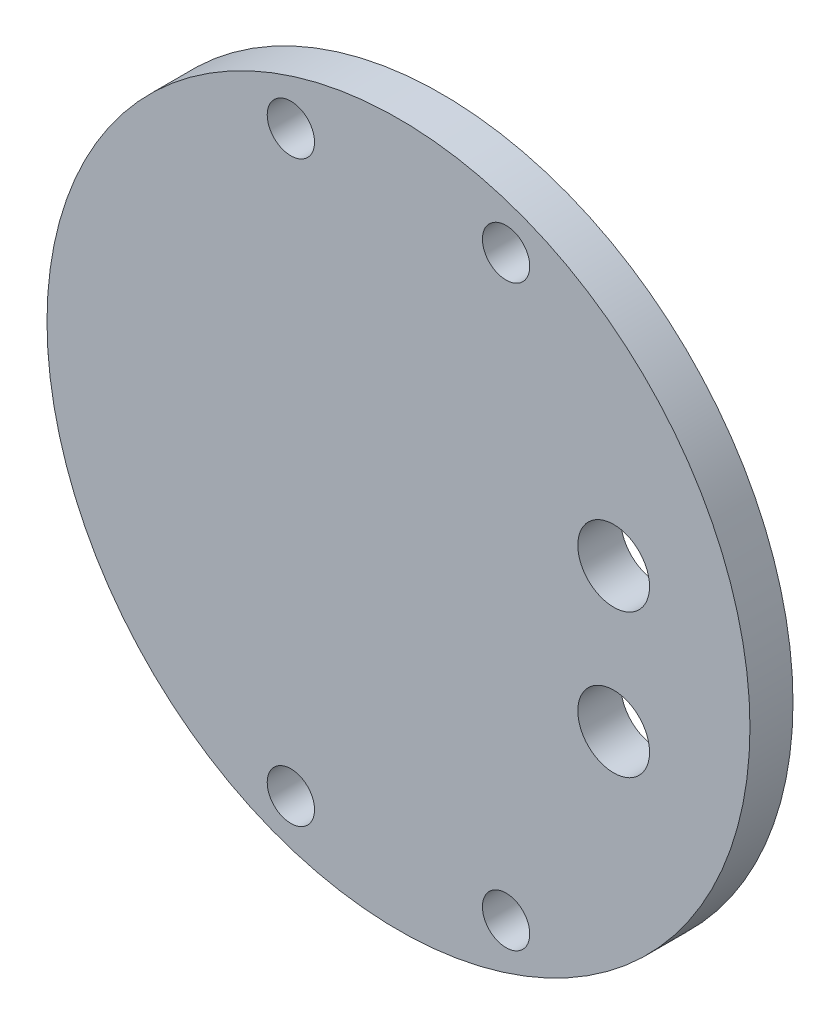
ISO-10303-21;
HEADER;
FILE_DESCRIPTION(('STEP AP214'),'2;1');
FILE_NAME('part.step','',(''),(''),'','','');
FILE_SCHEMA(('AUTOMOTIVE_DESIGN { 1 0 10303 214 1 1 1 1 }'));
ENDSEC;
DATA;
#1=APPLICATION_CONTEXT('core data for automotive mechanical design processes');
#2=APPLICATION_PROTOCOL_DEFINITION('international standard','automotive_design',2000,#1);
#3=PRODUCT_CONTEXT('',#1,'mechanical');
#4=PRODUCT('Part','Part','',(#3));
#5=PRODUCT_RELATED_PRODUCT_CATEGORY('part','',(#4));
#6=PRODUCT_DEFINITION_FORMATION('','',#4);
#7=PRODUCT_DEFINITION_CONTEXT('part definition',#1,'design');
#8=PRODUCT_DEFINITION('design','',#6,#7);
#9=PRODUCT_DEFINITION_SHAPE('','',#8);
#10=(LENGTH_UNIT() NAMED_UNIT(*) SI_UNIT(.MILLI.,.METRE.));
#11=(NAMED_UNIT(*) PLANE_ANGLE_UNIT() SI_UNIT($,.RADIAN.));
#12=(NAMED_UNIT(*) SI_UNIT($,.STERADIAN.) SOLID_ANGLE_UNIT());
#13=UNCERTAINTY_MEASURE_WITH_UNIT(LENGTH_MEASURE(1.E-05),#10,'distance_accuracy_value','');
#14=(GEOMETRIC_REPRESENTATION_CONTEXT(3) GLOBAL_UNCERTAINTY_ASSIGNED_CONTEXT((#13)) GLOBAL_UNIT_ASSIGNED_CONTEXT((#10,
#11,#12)) REPRESENTATION_CONTEXT('',''));
#15=CARTESIAN_POINT('',(0.,0.,0.));
#16=DIRECTION('',(0.,0.,1.));
#17=DIRECTION('',(1.,0.,0.));
#18=AXIS2_PLACEMENT_3D('',#15,#16,#17);
#19=CARTESIAN_POINT('',(0.,0.,0.));
#20=DIRECTION('',(0.,0.,1.));
#21=DIRECTION('',(1.,0.,0.));
#22=AXIS2_PLACEMENT_3D('',#19,#20,#21);
#23=CYLINDRICAL_SURFACE('',#22,49.);
#24=CARTESIAN_POINT('',(0.,0.,0.));
#25=DIRECTION('',(0.,0.,1.));
#26=DIRECTION('',(-1.,0.,0.));
#27=AXIS2_PLACEMENT_3D('',#24,#25,#26);
#28=CIRCLE('',#27,49.);
#29=CARTESIAN_POINT('',(-49.,0.,0.));
#30=VERTEX_POINT('',#29);
#31=EDGE_CURVE('E10',#30,#30,#28,.T.);
#32=ORIENTED_EDGE('',*,*,#31,.T.);
#33=EDGE_LOOP('',(#32));
#34=FACE_BOUND('',#33,.T.);
#35=CARTESIAN_POINT('',(0.,0.,6.));
#36=DIRECTION('',(0.,0.,1.));
#37=DIRECTION('',(-1.,0.,0.));
#38=AXIS2_PLACEMENT_3D('',#35,#36,#37);
#39=CIRCLE('',#38,49.);
#40=CARTESIAN_POINT('',(-49.,0.,6.));
#41=VERTEX_POINT('',#40);
#42=EDGE_CURVE('E40',#41,#41,#39,.T.);
#43=ORIENTED_EDGE('',*,*,#42,.F.);
#44=EDGE_LOOP('',(#43));
#45=FACE_BOUND('',#44,.T.);
#46=ADVANCED_FACE('F37',(#34,#45),#23,.T.);
#47=CARTESIAN_POINT('',(0.,0.,0.));
#48=DIRECTION('',(0.,0.,-1.));
#49=DIRECTION('',(-1.,0.,0.));
#50=AXIS2_PLACEMENT_3D('',#47,#48,#49);
#51=PLANE('',#50);
#52=CARTESIAN_POINT('',(30.,10.,0.));
#53=DIRECTION('',(0.,0.,1.));
#54=DIRECTION('',(1.,0.,0.));
#55=AXIS2_PLACEMENT_3D('',#52,#53,#54);
#56=CIRCLE('',#55,5.);
#57=CARTESIAN_POINT('',(35.,10.,0.));
#58=VERTEX_POINT('',#57);
#59=EDGE_CURVE('E79',#58,#58,#56,.T.);
#60=ORIENTED_EDGE('',*,*,#59,.T.);
#61=EDGE_LOOP('',(#60));
#62=FACE_BOUND('',#61,.T.);
#63=CARTESIAN_POINT('',(30.,-10.,0.));
#64=DIRECTION('',(0.,0.,1.));
#65=DIRECTION('',(1.,0.,0.));
#66=AXIS2_PLACEMENT_3D('',#63,#64,#65);
#67=CIRCLE('',#66,5.);
#68=CARTESIAN_POINT('',(35.,-10.,0.));
#69=VERTEX_POINT('',#68);
#70=EDGE_CURVE('E87',#69,#69,#67,.T.);
#71=ORIENTED_EDGE('',*,*,#70,.T.);
#72=EDGE_LOOP('',(#71));
#73=FACE_BOUND('',#72,.T.);
#74=CARTESIAN_POINT('',(-15.,-40.3000021613147,0.));
#75=DIRECTION('',(0.,0.,1.));
#76=DIRECTION('',(-1.,0.,0.));
#77=AXIS2_PLACEMENT_3D('',#74,#75,#76);
#78=CIRCLE('',#77,3.3);
#79=CARTESIAN_POINT('',(-18.3,-40.3000021613147,0.));
#80=VERTEX_POINT('',#79);
#81=EDGE_CURVE('E71',#80,#80,#78,.T.);
#82=ORIENTED_EDGE('',*,*,#81,.T.);
#83=EDGE_LOOP('',(#82));
#84=FACE_BOUND('',#83,.T.);
#85=CARTESIAN_POINT('',(-15.,40.3000021613147,0.));
#86=DIRECTION('',(0.,0.,1.));
#87=DIRECTION('',(-1.,0.,0.));
#88=AXIS2_PLACEMENT_3D('',#85,#86,#87);
#89=CIRCLE('',#88,3.3);
#90=CARTESIAN_POINT('',(-18.3,40.3000021613147,0.));
#91=VERTEX_POINT('',#90);
#92=EDGE_CURVE('E63',#91,#91,#89,.T.);
#93=ORIENTED_EDGE('',*,*,#92,.T.);
#94=EDGE_LOOP('',(#93));
#95=FACE_BOUND('',#94,.T.);
#96=CARTESIAN_POINT('',(15.,-40.3000021613147,0.));
#97=DIRECTION('',(0.,0.,1.));
#98=DIRECTION('',(-1.,0.,0.));
#99=AXIS2_PLACEMENT_3D('',#96,#97,#98);
#100=CIRCLE('',#99,3.3);
#101=CARTESIAN_POINT('',(11.7,-40.3000021613147,0.));
#102=VERTEX_POINT('',#101);
#103=EDGE_CURVE('E55',#102,#102,#100,.T.);
#104=ORIENTED_EDGE('',*,*,#103,.T.);
#105=EDGE_LOOP('',(#104));
#106=FACE_BOUND('',#105,.T.);
#107=CARTESIAN_POINT('',(15.,40.3000021613147,0.));
#108=DIRECTION('',(0.,0.,1.));
#109=DIRECTION('',(-1.,0.,0.));
#110=AXIS2_PLACEMENT_3D('',#107,#108,#109);
#111=CIRCLE('',#110,3.3);
#112=CARTESIAN_POINT('',(11.7,40.3000021613147,0.));
#113=VERTEX_POINT('',#112);
#114=EDGE_CURVE('E49',#113,#113,#111,.T.);
#115=ORIENTED_EDGE('',*,*,#114,.T.);
#116=EDGE_LOOP('',(#115));
#117=FACE_BOUND('',#116,.T.);
#118=ORIENTED_EDGE('',*,*,#31,.F.);
#119=EDGE_LOOP('',(#118));
#120=FACE_BOUND('',#119,.T.);
#121=ADVANCED_FACE('F99',(#62,#73,#84,#95,#106,#117,#120),#51,.T.);
#122=CARTESIAN_POINT('',(0.,0.,6.));
#123=DIRECTION('',(0.,0.,-1.));
#124=DIRECTION('',(-1.,0.,0.));
#125=AXIS2_PLACEMENT_3D('',#122,#123,#124);
#126=PLANE('',#125);
#127=CARTESIAN_POINT('',(30.,10.,6.));
#128=DIRECTION('',(0.,0.,1.));
#129=DIRECTION('',(1.,0.,0.));
#130=AXIS2_PLACEMENT_3D('',#127,#128,#129);
#131=CIRCLE('',#130,5.);
#132=CARTESIAN_POINT('',(35.,10.,6.));
#133=VERTEX_POINT('',#132);
#134=EDGE_CURVE('E91',#133,#133,#131,.T.);
#135=ORIENTED_EDGE('',*,*,#134,.F.);
#136=EDGE_LOOP('',(#135));
#137=FACE_BOUND('',#136,.T.);
#138=CARTESIAN_POINT('',(30.,-10.,6.));
#139=DIRECTION('',(0.,0.,1.));
#140=DIRECTION('',(1.,0.,0.));
#141=AXIS2_PLACEMENT_3D('',#138,#139,#140);
#142=CIRCLE('',#141,5.);
#143=CARTESIAN_POINT('',(35.,-10.,6.));
#144=VERTEX_POINT('',#143);
#145=EDGE_CURVE('E83',#144,#144,#142,.T.);
#146=ORIENTED_EDGE('',*,*,#145,.F.);
#147=EDGE_LOOP('',(#146));
#148=FACE_BOUND('',#147,.T.);
#149=CARTESIAN_POINT('',(-15.,-40.3000021613147,6.));
#150=DIRECTION('',(0.,0.,1.));
#151=DIRECTION('',(-1.,0.,0.));
#152=AXIS2_PLACEMENT_3D('',#149,#150,#151);
#153=CIRCLE('',#152,3.3);
#154=CARTESIAN_POINT('',(-18.3,-40.3000021613147,6.));
#155=VERTEX_POINT('',#154);
#156=EDGE_CURVE('E75',#155,#155,#153,.T.);
#157=ORIENTED_EDGE('',*,*,#156,.F.);
#158=EDGE_LOOP('',(#157));
#159=FACE_BOUND('',#158,.T.);
#160=CARTESIAN_POINT('',(-15.,40.3000021613147,6.));
#161=DIRECTION('',(0.,0.,1.));
#162=DIRECTION('',(-1.,0.,0.));
#163=AXIS2_PLACEMENT_3D('',#160,#161,#162);
#164=CIRCLE('',#163,3.3);
#165=CARTESIAN_POINT('',(-18.3,40.3000021613147,6.));
#166=VERTEX_POINT('',#165);
#167=EDGE_CURVE('E67',#166,#166,#164,.T.);
#168=ORIENTED_EDGE('',*,*,#167,.F.);
#169=EDGE_LOOP('',(#168));
#170=FACE_BOUND('',#169,.T.);
#171=CARTESIAN_POINT('',(15.,-40.3000021613147,6.));
#172=DIRECTION('',(0.,0.,1.));
#173=DIRECTION('',(-1.,0.,0.));
#174=AXIS2_PLACEMENT_3D('',#171,#172,#173);
#175=CIRCLE('',#174,3.3);
#176=CARTESIAN_POINT('',(11.7,-40.3000021613147,6.));
#177=VERTEX_POINT('',#176);
#178=EDGE_CURVE('E59',#177,#177,#175,.T.);
#179=ORIENTED_EDGE('',*,*,#178,.F.);
#180=EDGE_LOOP('',(#179));
#181=FACE_BOUND('',#180,.T.);
#182=CARTESIAN_POINT('',(15.,40.3000021613147,6.));
#183=DIRECTION('',(0.,0.,1.));
#184=DIRECTION('',(-1.,0.,0.));
#185=AXIS2_PLACEMENT_3D('',#182,#183,#184);
#186=CIRCLE('',#185,3.3);
#187=CARTESIAN_POINT('',(11.7,40.3000021613147,6.));
#188=VERTEX_POINT('',#187);
#189=EDGE_CURVE('E51',#188,#188,#186,.T.);
#190=ORIENTED_EDGE('',*,*,#189,.F.);
#191=EDGE_LOOP('',(#190));
#192=FACE_BOUND('',#191,.T.);
#193=ORIENTED_EDGE('',*,*,#42,.T.);
#194=EDGE_LOOP('',(#193));
#195=FACE_BOUND('',#194,.T.);
#196=ADVANCED_FACE('F109',(#137,#148,#159,#170,#181,#192,#195),#126,.F.);
#197=CARTESIAN_POINT('',(15.,40.3000021613147,0.));
#198=DIRECTION('',(0.,0.,1.));
#199=DIRECTION('',(1.,0.,0.));
#200=AXIS2_PLACEMENT_3D('',#197,#198,#199);
#201=CYLINDRICAL_SURFACE('',#200,3.3);
#202=ORIENTED_EDGE('',*,*,#114,.F.);
#203=EDGE_LOOP('',(#202));
#204=FACE_BOUND('',#203,.T.);
#205=ORIENTED_EDGE('',*,*,#189,.T.);
#206=EDGE_LOOP('',(#205));
#207=FACE_BOUND('',#206,.T.);
#208=ADVANCED_FACE('F112',(#204,#207),#201,.F.);
#209=CARTESIAN_POINT('',(15.,-40.3000021613147,0.));
#210=DIRECTION('',(0.,0.,1.));
#211=DIRECTION('',(1.,0.,0.));
#212=AXIS2_PLACEMENT_3D('',#209,#210,#211);
#213=CYLINDRICAL_SURFACE('',#212,3.3);
#214=ORIENTED_EDGE('',*,*,#103,.F.);
#215=EDGE_LOOP('',(#214));
#216=FACE_BOUND('',#215,.T.);
#217=ORIENTED_EDGE('',*,*,#178,.T.);
#218=EDGE_LOOP('',(#217));
#219=FACE_BOUND('',#218,.T.);
#220=ADVANCED_FACE('F135',(#216,#219),#213,.F.);
#221=CARTESIAN_POINT('',(-15.,40.3000021613147,0.));
#222=DIRECTION('',(0.,0.,1.));
#223=DIRECTION('',(1.,0.,0.));
#224=AXIS2_PLACEMENT_3D('',#221,#222,#223);
#225=CYLINDRICAL_SURFACE('',#224,3.3);
#226=ORIENTED_EDGE('',*,*,#92,.F.);
#227=EDGE_LOOP('',(#226));
#228=FACE_BOUND('',#227,.T.);
#229=ORIENTED_EDGE('',*,*,#167,.T.);
#230=EDGE_LOOP('',(#229));
#231=FACE_BOUND('',#230,.T.);
#232=ADVANCED_FACE('F139',(#228,#231),#225,.F.);
#233=CARTESIAN_POINT('',(-15.,-40.3000021613147,0.));
#234=DIRECTION('',(0.,0.,1.));
#235=DIRECTION('',(1.,0.,0.));
#236=AXIS2_PLACEMENT_3D('',#233,#234,#235);
#237=CYLINDRICAL_SURFACE('',#236,3.3);
#238=ORIENTED_EDGE('',*,*,#81,.F.);
#239=EDGE_LOOP('',(#238));
#240=FACE_BOUND('',#239,.T.);
#241=ORIENTED_EDGE('',*,*,#156,.T.);
#242=EDGE_LOOP('',(#241));
#243=FACE_BOUND('',#242,.T.);
#244=ADVANCED_FACE('F143',(#240,#243),#237,.F.);
#245=CARTESIAN_POINT('',(30.,-10.,0.));
#246=DIRECTION('',(0.,0.,1.));
#247=DIRECTION('',(1.,0.,0.));
#248=AXIS2_PLACEMENT_3D('',#245,#246,#247);
#249=CYLINDRICAL_SURFACE('',#248,5.);
#250=ORIENTED_EDGE('',*,*,#70,.F.);
#251=EDGE_LOOP('',(#250));
#252=FACE_BOUND('',#251,.T.);
#253=ORIENTED_EDGE('',*,*,#145,.T.);
#254=EDGE_LOOP('',(#253));
#255=FACE_BOUND('',#254,.T.);
#256=ADVANCED_FACE('F105',(#252,#255),#249,.F.);
#257=CARTESIAN_POINT('',(30.,10.,0.));
#258=DIRECTION('',(0.,0.,1.));
#259=DIRECTION('',(1.,0.,0.));
#260=AXIS2_PLACEMENT_3D('',#257,#258,#259);
#261=CYLINDRICAL_SURFACE('',#260,5.);
#262=ORIENTED_EDGE('',*,*,#59,.F.);
#263=EDGE_LOOP('',(#262));
#264=FACE_BOUND('',#263,.T.);
#265=ORIENTED_EDGE('',*,*,#134,.T.);
#266=EDGE_LOOP('',(#265));
#267=FACE_BOUND('',#266,.T.);
#268=ADVANCED_FACE('F102',(#264,#267),#261,.F.);
#269=CLOSED_SHELL('',(#46,#121,#196,#208,#220,#232,#244,#256,#268));
#270=MANIFOLD_SOLID_BREP('B2',#269);
#271=ADVANCED_BREP_SHAPE_REPRESENTATION('',(#18,#270),#14);
#272=SHAPE_DEFINITION_REPRESENTATION(#9,#271);
ENDSEC;
END-ISO-10303-21;
